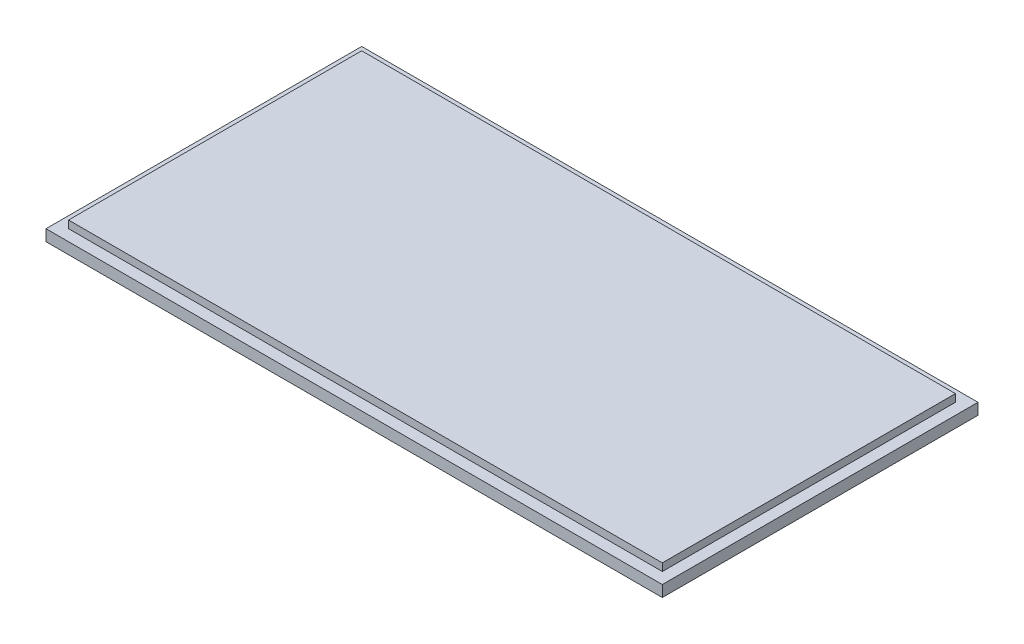
ISO-10303-21;
HEADER;
FILE_DESCRIPTION(('STEP AP214'),'2;1');
FILE_NAME('part.step','',(''),(''),'','','');
FILE_SCHEMA(('AUTOMOTIVE_DESIGN { 1 0 10303 214 1 1 1 1 }'));
ENDSEC;
DATA;
#1=APPLICATION_CONTEXT('core data for automotive mechanical design processes');
#2=APPLICATION_PROTOCOL_DEFINITION('international standard','automotive_design',2000,#1);
#3=PRODUCT_CONTEXT('',#1,'mechanical');
#4=PRODUCT('Part','Part','',(#3));
#5=PRODUCT_RELATED_PRODUCT_CATEGORY('part','',(#4));
#6=PRODUCT_DEFINITION_FORMATION('','',#4);
#7=PRODUCT_DEFINITION_CONTEXT('part definition',#1,'design');
#8=PRODUCT_DEFINITION('design','',#6,#7);
#9=PRODUCT_DEFINITION_SHAPE('','',#8);
#10=(LENGTH_UNIT() NAMED_UNIT(*) SI_UNIT(.MILLI.,.METRE.));
#11=(NAMED_UNIT(*) PLANE_ANGLE_UNIT() SI_UNIT($,.RADIAN.));
#12=(NAMED_UNIT(*) SI_UNIT($,.STERADIAN.) SOLID_ANGLE_UNIT());
#13=UNCERTAINTY_MEASURE_WITH_UNIT(LENGTH_MEASURE(1.E-05),#10,'distance_accuracy_value','');
#14=(GEOMETRIC_REPRESENTATION_CONTEXT(3) GLOBAL_UNCERTAINTY_ASSIGNED_CONTEXT((#13)) GLOBAL_UNIT_ASSIGNED_CONTEXT((#10,
#11,#12)) REPRESENTATION_CONTEXT('',''));
#15=CARTESIAN_POINT('',(0.,0.,0.));
#16=DIRECTION('',(0.,0.,1.));
#17=DIRECTION('',(1.,0.,0.));
#18=AXIS2_PLACEMENT_3D('',#15,#16,#17);
#19=CARTESIAN_POINT('',(0.,3.,0.));
#20=DIRECTION('',(0.,-1.,0.));
#21=DIRECTION('',(0.,0.,-1.));
#22=AXIS2_PLACEMENT_3D('',#19,#20,#21);
#23=PLANE('',#22);
#24=DIRECTION('',(0.,0.,1.));
#25=VECTOR('',#24,1.);
#26=CARTESIAN_POINT('',(0.,3.,0.));
#27=LINE('',#26,#25);
#28=CARTESIAN_POINT('',(0.,3.,-84.));
#29=VERTEX_POINT('',#28);
#30=CARTESIAN_POINT('',(0.,3.,0.));
#31=VERTEX_POINT('',#30);
#32=EDGE_CURVE('E139',#29,#31,#27,.T.);
#33=ORIENTED_EDGE('',*,*,#32,.T.);
#34=DIRECTION('',(1.,0.,0.));
#35=VECTOR('',#34,1.);
#36=CARTESIAN_POINT('',(0.,3.,0.));
#37=LINE('',#36,#35);
#38=CARTESIAN_POINT('',(164.,3.,0.));
#39=VERTEX_POINT('',#38);
#40=EDGE_CURVE('E143',#31,#39,#37,.T.);
#41=ORIENTED_EDGE('',*,*,#40,.T.);
#42=DIRECTION('',(0.,0.,-1.));
#43=VECTOR('',#42,1.);
#44=CARTESIAN_POINT('',(164.,3.,0.));
#45=LINE('',#44,#43);
#46=CARTESIAN_POINT('',(164.,3.,-84.));
#47=VERTEX_POINT('',#46);
#48=EDGE_CURVE('E147',#39,#47,#45,.T.);
#49=ORIENTED_EDGE('',*,*,#48,.T.);
#50=DIRECTION('',(-1.,0.,0.));
#51=VECTOR('',#50,1.);
#52=CARTESIAN_POINT('',(0.,3.,-84.));
#53=LINE('',#52,#51);
#54=EDGE_CURVE('E150',#47,#29,#53,.T.);
#55=ORIENTED_EDGE('',*,*,#54,.T.);
#56=EDGE_LOOP('',(#33,#41,#49,#55));
#57=FACE_BOUND('',#56,.T.);
#58=DIRECTION('',(-1.,0.,0.));
#59=VECTOR('',#58,1.);
#60=CARTESIAN_POINT('',(161.,3.,-81.));
#61=LINE('',#60,#59);
#62=CARTESIAN_POINT('',(161.,3.,-81.));
#63=VERTEX_POINT('',#62);
#64=CARTESIAN_POINT('',(3.,3.,-81.));
#65=VERTEX_POINT('',#64);
#66=EDGE_CURVE('E55',#63,#65,#61,.T.);
#67=ORIENTED_EDGE('',*,*,#66,.F.);
#68=DIRECTION('',(0.,0.,-1.));
#69=VECTOR('',#68,1.);
#70=CARTESIAN_POINT('',(161.,3.,-3.));
#71=LINE('',#70,#69);
#72=CARTESIAN_POINT('',(161.,3.,-3.));
#73=VERTEX_POINT('',#72);
#74=EDGE_CURVE('E59',#73,#63,#71,.T.);
#75=ORIENTED_EDGE('',*,*,#74,.F.);
#76=DIRECTION('',(1.,0.,0.));
#77=VECTOR('',#76,1.);
#78=CARTESIAN_POINT('',(3.,3.,-3.));
#79=LINE('',#78,#77);
#80=CARTESIAN_POINT('',(3.,3.,-3.));
#81=VERTEX_POINT('',#80);
#82=EDGE_CURVE('E283',#81,#73,#79,.T.);
#83=ORIENTED_EDGE('',*,*,#82,.F.);
#84=DIRECTION('',(0.,0.,1.));
#85=VECTOR('',#84,1.);
#86=CARTESIAN_POINT('',(3.,3.,-81.));
#87=LINE('',#86,#85);
#88=EDGE_CURVE('E293',#65,#81,#87,.T.);
#89=ORIENTED_EDGE('',*,*,#88,.F.);
#90=EDGE_LOOP('',(#67,#75,#83,#89));
#91=FACE_BOUND('',#90,.T.);
#92=ADVANCED_FACE('F39',(#57,#91),#23,.F.);
#93=CARTESIAN_POINT('',(0.,3.,0.));
#94=DIRECTION('',(1.,0.,0.));
#95=DIRECTION('',(0.,0.,-1.));
#96=AXIS2_PLACEMENT_3D('',#93,#94,#95);
#97=PLANE('',#96);
#98=DIRECTION('',(0.,0.,1.));
#99=VECTOR('',#98,1.);
#100=CARTESIAN_POINT('',(0.,0.,0.));
#101=LINE('',#100,#99);
#102=CARTESIAN_POINT('',(0.,0.,-84.));
#103=VERTEX_POINT('',#102);
#104=CARTESIAN_POINT('',(0.,0.,0.));
#105=VERTEX_POINT('',#104);
#106=EDGE_CURVE('E128',#103,#105,#101,.T.);
#107=ORIENTED_EDGE('',*,*,#106,.T.);
#108=DIRECTION('',(0.,-1.,0.));
#109=VECTOR('',#108,1.);
#110=CARTESIAN_POINT('',(0.,3.,0.));
#111=LINE('',#110,#109);
#112=EDGE_CURVE('E11',#31,#105,#111,.T.);
#113=ORIENTED_EDGE('',*,*,#112,.F.);
#114=ORIENTED_EDGE('',*,*,#32,.F.);
#115=DIRECTION('',(0.,-1.,0.));
#116=VECTOR('',#115,1.);
#117=CARTESIAN_POINT('',(0.,3.,-84.));
#118=LINE('',#117,#116);
#119=EDGE_CURVE('E152',#29,#103,#118,.T.);
#120=ORIENTED_EDGE('',*,*,#119,.T.);
#121=EDGE_LOOP('',(#107,#113,#114,#120));
#122=FACE_BOUND('',#121,.T.);
#123=ADVANCED_FACE('F41',(#122),#97,.F.);
#124=CARTESIAN_POINT('',(0.,3.,0.));
#125=DIRECTION('',(0.,0.,-1.));
#126=DIRECTION('',(-1.,0.,0.));
#127=AXIS2_PLACEMENT_3D('',#124,#125,#126);
#128=PLANE('',#127);
#129=DIRECTION('',(1.,0.,0.));
#130=VECTOR('',#129,1.);
#131=CARTESIAN_POINT('',(0.,0.,0.));
#132=LINE('',#131,#130);
#133=CARTESIAN_POINT('',(164.,0.,0.));
#134=VERTEX_POINT('',#133);
#135=EDGE_CURVE('E133',#105,#134,#132,.T.);
#136=ORIENTED_EDGE('',*,*,#135,.T.);
#137=DIRECTION('',(0.,-1.,0.));
#138=VECTOR('',#137,1.);
#139=CARTESIAN_POINT('',(164.,3.,0.));
#140=LINE('',#139,#138);
#141=EDGE_CURVE('E48',#39,#134,#140,.T.);
#142=ORIENTED_EDGE('',*,*,#141,.F.);
#143=ORIENTED_EDGE('',*,*,#40,.F.);
#144=ORIENTED_EDGE('',*,*,#112,.T.);
#145=EDGE_LOOP('',(#136,#142,#143,#144));
#146=FACE_BOUND('',#145,.T.);
#147=ADVANCED_FACE('F188',(#146),#128,.F.);
#148=CARTESIAN_POINT('',(164.,3.,0.));
#149=DIRECTION('',(-1.,0.,0.));
#150=DIRECTION('',(0.,0.,1.));
#151=AXIS2_PLACEMENT_3D('',#148,#149,#150);
#152=PLANE('',#151);
#153=DIRECTION('',(0.,0.,-1.));
#154=VECTOR('',#153,1.);
#155=CARTESIAN_POINT('',(164.,0.,0.));
#156=LINE('',#155,#154);
#157=CARTESIAN_POINT('',(164.,0.,-84.));
#158=VERTEX_POINT('',#157);
#159=EDGE_CURVE('E156',#134,#158,#156,.T.);
#160=ORIENTED_EDGE('',*,*,#159,.T.);
#161=DIRECTION('',(0.,-1.,0.));
#162=VECTOR('',#161,1.);
#163=CARTESIAN_POINT('',(164.,3.,-84.));
#164=LINE('',#163,#162);
#165=EDGE_CURVE('E164',#47,#158,#164,.T.);
#166=ORIENTED_EDGE('',*,*,#165,.F.);
#167=ORIENTED_EDGE('',*,*,#48,.F.);
#168=ORIENTED_EDGE('',*,*,#141,.T.);
#169=EDGE_LOOP('',(#160,#166,#167,#168));
#170=FACE_BOUND('',#169,.T.);
#171=ADVANCED_FACE('F173',(#170),#152,.F.);
#172=CARTESIAN_POINT('',(0.,3.,-84.));
#173=DIRECTION('',(0.,0.,1.));
#174=DIRECTION('',(1.,0.,0.));
#175=AXIS2_PLACEMENT_3D('',#172,#173,#174);
#176=PLANE('',#175);
#177=DIRECTION('',(-1.,0.,0.));
#178=VECTOR('',#177,1.);
#179=CARTESIAN_POINT('',(0.,0.,-84.));
#180=LINE('',#179,#178);
#181=EDGE_CURVE('E144',#158,#103,#180,.T.);
#182=ORIENTED_EDGE('',*,*,#181,.T.);
#183=ORIENTED_EDGE('',*,*,#119,.F.);
#184=ORIENTED_EDGE('',*,*,#54,.F.);
#185=ORIENTED_EDGE('',*,*,#165,.T.);
#186=EDGE_LOOP('',(#182,#183,#184,#185));
#187=FACE_BOUND('',#186,.T.);
#188=ADVANCED_FACE('F182',(#187),#176,.F.);
#189=CARTESIAN_POINT('',(0.,0.,0.));
#190=DIRECTION('',(0.,-1.,0.));
#191=DIRECTION('',(0.,0.,-1.));
#192=AXIS2_PLACEMENT_3D('',#189,#190,#191);
#193=PLANE('',#192);
#194=ORIENTED_EDGE('',*,*,#106,.F.);
#195=ORIENTED_EDGE('',*,*,#181,.F.);
#196=ORIENTED_EDGE('',*,*,#159,.F.);
#197=ORIENTED_EDGE('',*,*,#135,.F.);
#198=EDGE_LOOP('',(#194,#195,#196,#197));
#199=FACE_BOUND('',#198,.T.);
#200=ADVANCED_FACE('F179',(#199),#193,.T.);
#201=CARTESIAN_POINT('',(161.,5.,-81.));
#202=DIRECTION('',(0.,0.,1.));
#203=DIRECTION('',(1.,0.,0.));
#204=AXIS2_PLACEMENT_3D('',#201,#202,#203);
#205=PLANE('',#204);
#206=ORIENTED_EDGE('',*,*,#66,.T.);
#207=DIRECTION('',(0.,-1.,0.));
#208=VECTOR('',#207,1.);
#209=CARTESIAN_POINT('',(3.,5.,-81.));
#210=LINE('',#209,#208);
#211=CARTESIAN_POINT('',(3.,5.,-81.));
#212=VERTEX_POINT('',#211);
#213=EDGE_CURVE('E108',#212,#65,#210,.T.);
#214=ORIENTED_EDGE('',*,*,#213,.F.);
#215=DIRECTION('',(-1.,0.,0.));
#216=VECTOR('',#215,1.);
#217=CARTESIAN_POINT('',(161.,5.,-81.));
#218=LINE('',#217,#216);
#219=CARTESIAN_POINT('',(161.,5.,-81.));
#220=VERTEX_POINT('',#219);
#221=EDGE_CURVE('E115',#220,#212,#218,.T.);
#222=ORIENTED_EDGE('',*,*,#221,.F.);
#223=DIRECTION('',(0.,-1.,0.));
#224=VECTOR('',#223,1.);
#225=CARTESIAN_POINT('',(161.,5.,-81.));
#226=LINE('',#225,#224);
#227=EDGE_CURVE('E280',#220,#63,#226,.T.);
#228=ORIENTED_EDGE('',*,*,#227,.T.);
#229=EDGE_LOOP('',(#206,#214,#222,#228));
#230=FACE_BOUND('',#229,.T.);
#231=ADVANCED_FACE('F126',(#230),#205,.F.);
#232=CARTESIAN_POINT('',(3.,5.,-81.));
#233=DIRECTION('',(1.,0.,0.));
#234=DIRECTION('',(0.,0.,-1.));
#235=AXIS2_PLACEMENT_3D('',#232,#233,#234);
#236=PLANE('',#235);
#237=ORIENTED_EDGE('',*,*,#88,.T.);
#238=DIRECTION('',(0.,-1.,0.));
#239=VECTOR('',#238,1.);
#240=CARTESIAN_POINT('',(3.,5.,-3.));
#241=LINE('',#240,#239);
#242=CARTESIAN_POINT('',(3.,5.,-3.));
#243=VERTEX_POINT('',#242);
#244=EDGE_CURVE('E110',#243,#81,#241,.T.);
#245=ORIENTED_EDGE('',*,*,#244,.F.);
#246=DIRECTION('',(0.,0.,1.));
#247=VECTOR('',#246,1.);
#248=CARTESIAN_POINT('',(3.,5.,-81.));
#249=LINE('',#248,#247);
#250=EDGE_CURVE('E103',#212,#243,#249,.T.);
#251=ORIENTED_EDGE('',*,*,#250,.F.);
#252=ORIENTED_EDGE('',*,*,#213,.T.);
#253=EDGE_LOOP('',(#237,#245,#251,#252));
#254=FACE_BOUND('',#253,.T.);
#255=ADVANCED_FACE('F106',(#254),#236,.F.);
#256=CARTESIAN_POINT('',(3.,5.,-3.));
#257=DIRECTION('',(0.,0.,-1.));
#258=DIRECTION('',(-1.,0.,0.));
#259=AXIS2_PLACEMENT_3D('',#256,#257,#258);
#260=PLANE('',#259);
#261=ORIENTED_EDGE('',*,*,#82,.T.);
#262=DIRECTION('',(0.,-1.,0.));
#263=VECTOR('',#262,1.);
#264=CARTESIAN_POINT('',(161.,5.,-3.));
#265=LINE('',#264,#263);
#266=CARTESIAN_POINT('',(161.,5.,-3.));
#267=VERTEX_POINT('',#266);
#268=EDGE_CURVE('E135',#267,#73,#265,.T.);
#269=ORIENTED_EDGE('',*,*,#268,.F.);
#270=DIRECTION('',(1.,0.,0.));
#271=VECTOR('',#270,1.);
#272=CARTESIAN_POINT('',(3.,5.,-3.));
#273=LINE('',#272,#271);
#274=EDGE_CURVE('E114',#243,#267,#273,.T.);
#275=ORIENTED_EDGE('',*,*,#274,.F.);
#276=ORIENTED_EDGE('',*,*,#244,.T.);
#277=EDGE_LOOP('',(#261,#269,#275,#276));
#278=FACE_BOUND('',#277,.T.);
#279=ADVANCED_FACE('F224',(#278),#260,.F.);
#280=CARTESIAN_POINT('',(161.,5.,-3.));
#281=DIRECTION('',(-1.,0.,0.));
#282=DIRECTION('',(0.,0.,1.));
#283=AXIS2_PLACEMENT_3D('',#280,#281,#282);
#284=PLANE('',#283);
#285=ORIENTED_EDGE('',*,*,#74,.T.);
#286=ORIENTED_EDGE('',*,*,#227,.F.);
#287=DIRECTION('',(0.,0.,-1.));
#288=VECTOR('',#287,1.);
#289=CARTESIAN_POINT('',(161.,5.,-3.));
#290=LINE('',#289,#288);
#291=EDGE_CURVE('E120',#267,#220,#290,.T.);
#292=ORIENTED_EDGE('',*,*,#291,.F.);
#293=ORIENTED_EDGE('',*,*,#268,.T.);
#294=EDGE_LOOP('',(#285,#286,#292,#293));
#295=FACE_BOUND('',#294,.T.);
#296=ADVANCED_FACE('F230',(#295),#284,.F.);
#297=CARTESIAN_POINT('',(0.,5.,0.));
#298=DIRECTION('',(0.,1.,0.));
#299=DIRECTION('',(0.,0.,1.));
#300=AXIS2_PLACEMENT_3D('',#297,#298,#299);
#301=PLANE('',#300);
#302=ORIENTED_EDGE('',*,*,#221,.T.);
#303=ORIENTED_EDGE('',*,*,#250,.T.);
#304=ORIENTED_EDGE('',*,*,#274,.T.);
#305=ORIENTED_EDGE('',*,*,#291,.T.);
#306=EDGE_LOOP('',(#302,#303,#304,#305));
#307=FACE_BOUND('',#306,.T.);
#308=ADVANCED_FACE('F118',(#307),#301,.T.);
#309=CLOSED_SHELL('',(#92,#123,#147,#171,#188,#200,#231,#255,#279,#296,#308));
#310=MANIFOLD_SOLID_BREP('B2',#309);
#311=ADVANCED_BREP_SHAPE_REPRESENTATION('',(#18,#310),#14);
#312=SHAPE_DEFINITION_REPRESENTATION(#9,#311);
ENDSEC;
END-ISO-10303-21;
